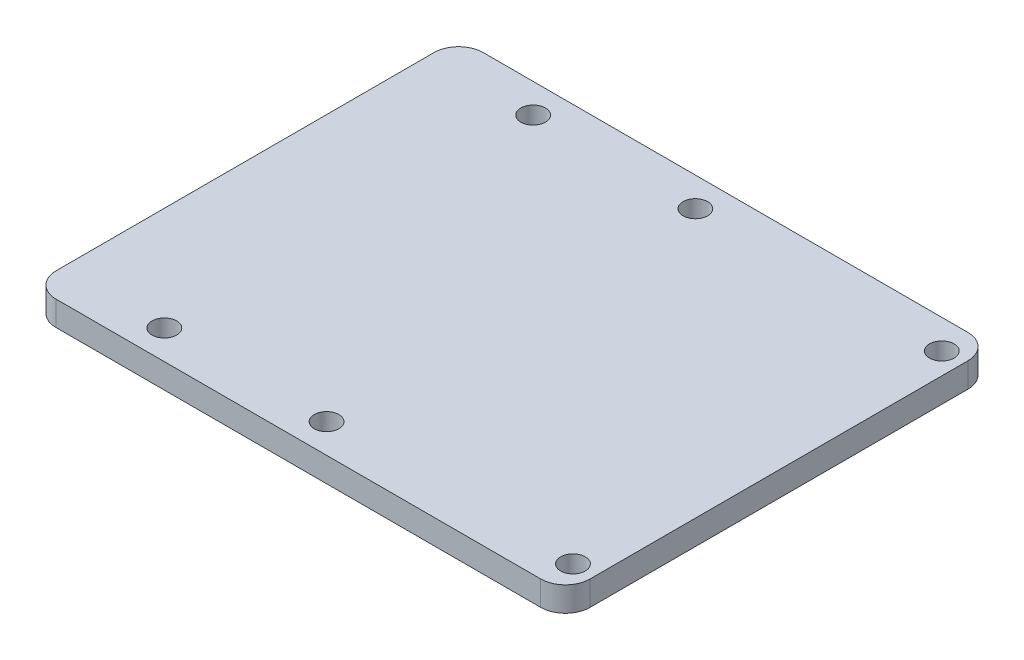
ISO-10303-21;
HEADER;
FILE_DESCRIPTION(('STEP AP214'),'2;1');
FILE_NAME('part.step','',(''),(''),'','','');
FILE_SCHEMA(('AUTOMOTIVE_DESIGN { 1 0 10303 214 1 1 1 1 }'));
ENDSEC;
DATA;
#1=APPLICATION_CONTEXT('core data for automotive mechanical design processes');
#2=APPLICATION_PROTOCOL_DEFINITION('international standard','automotive_design',2000,#1);
#3=PRODUCT_CONTEXT('',#1,'mechanical');
#4=PRODUCT('Part','Part','',(#3));
#5=PRODUCT_RELATED_PRODUCT_CATEGORY('part','',(#4));
#6=PRODUCT_DEFINITION_FORMATION('','',#4);
#7=PRODUCT_DEFINITION_CONTEXT('part definition',#1,'design');
#8=PRODUCT_DEFINITION('design','',#6,#7);
#9=PRODUCT_DEFINITION_SHAPE('','',#8);
#10=(LENGTH_UNIT() NAMED_UNIT(*) SI_UNIT(.MILLI.,.METRE.));
#11=(NAMED_UNIT(*) PLANE_ANGLE_UNIT() SI_UNIT($,.RADIAN.));
#12=(NAMED_UNIT(*) SI_UNIT($,.STERADIAN.) SOLID_ANGLE_UNIT());
#13=UNCERTAINTY_MEASURE_WITH_UNIT(LENGTH_MEASURE(1.E-05),#10,'distance_accuracy_value','');
#14=(GEOMETRIC_REPRESENTATION_CONTEXT(3) GLOBAL_UNCERTAINTY_ASSIGNED_CONTEXT((#13)) GLOBAL_UNIT_ASSIGNED_CONTEXT((#10,
#11,#12)) REPRESENTATION_CONTEXT('',''));
#15=CARTESIAN_POINT('',(0.,0.,0.));
#16=DIRECTION('',(0.,0.,1.));
#17=DIRECTION('',(1.,0.,0.));
#18=AXIS2_PLACEMENT_3D('',#15,#16,#17);
#19=CARTESIAN_POINT('',(0.,3.,26.));
#20=DIRECTION('',(0.,0.,-1.));
#21=DIRECTION('',(-1.,0.,0.));
#22=AXIS2_PLACEMENT_3D('',#19,#20,#21);
#23=PLANE('',#22);
#24=DIRECTION('',(1.,0.,0.));
#25=VECTOR('',#24,1.);
#26=CARTESIAN_POINT('',(0.,0.,26.));
#27=LINE('',#26,#25);
#28=CARTESIAN_POINT('',(-34.5,0.,26.));
#29=VERTEX_POINT('',#28);
#30=CARTESIAN_POINT('',(24.5,0.,26.));
#31=VERTEX_POINT('',#30);
#32=EDGE_CURVE('E142',#29,#31,#27,.T.);
#33=ORIENTED_EDGE('',*,*,#32,.T.);
#34=DIRECTION('',(0.,-1.,0.));
#35=VECTOR('',#34,1.);
#36=CARTESIAN_POINT('',(24.5,3.,26.));
#37=LINE('',#36,#35);
#38=CARTESIAN_POINT('',(24.5,3.,26.));
#39=VERTEX_POINT('',#38);
#40=EDGE_CURVE('E119',#31,#39,#37,.F.);
#41=ORIENTED_EDGE('',*,*,#40,.T.);
#42=DIRECTION('',(1.,0.,0.));
#43=VECTOR('',#42,1.);
#44=CARTESIAN_POINT('',(0.,3.,26.));
#45=LINE('',#44,#43);
#46=CARTESIAN_POINT('',(-34.5,3.,26.));
#47=VERTEX_POINT('',#46);
#48=EDGE_CURVE('E198',#47,#39,#45,.T.);
#49=ORIENTED_EDGE('',*,*,#48,.F.);
#50=DIRECTION('',(0.,-1.,0.));
#51=VECTOR('',#50,1.);
#52=CARTESIAN_POINT('',(-34.5,0.,26.));
#53=LINE('',#52,#51);
#54=EDGE_CURVE('E124',#47,#29,#53,.T.);
#55=ORIENTED_EDGE('',*,*,#54,.T.);
#56=EDGE_LOOP('',(#33,#41,#49,#55));
#57=FACE_BOUND('',#56,.T.);
#58=ADVANCED_FACE('F45',(#57),#23,.F.);
#59=CARTESIAN_POINT('',(27.5,3.,0.));
#60=DIRECTION('',(-1.,0.,0.));
#61=DIRECTION('',(0.,0.,1.));
#62=AXIS2_PLACEMENT_3D('',#59,#60,#61);
#63=PLANE('',#62);
#64=DIRECTION('',(0.,0.,-1.));
#65=VECTOR('',#64,1.);
#66=CARTESIAN_POINT('',(27.5,3.,0.));
#67=LINE('',#66,#65);
#68=CARTESIAN_POINT('',(27.5,3.,23.));
#69=VERTEX_POINT('',#68);
#70=CARTESIAN_POINT('',(27.5,3.,-23.));
#71=VERTEX_POINT('',#70);
#72=EDGE_CURVE('E134',#69,#71,#67,.T.);
#73=ORIENTED_EDGE('',*,*,#72,.F.);
#74=DIRECTION('',(0.,-1.,0.));
#75=VECTOR('',#74,1.);
#76=CARTESIAN_POINT('',(27.5,3.,23.));
#77=LINE('',#76,#75);
#78=CARTESIAN_POINT('',(27.5,0.,23.));
#79=VERTEX_POINT('',#78);
#80=EDGE_CURVE('E118',#69,#79,#77,.T.);
#81=ORIENTED_EDGE('',*,*,#80,.T.);
#82=DIRECTION('',(0.,0.,-1.));
#83=VECTOR('',#82,1.);
#84=CARTESIAN_POINT('',(27.5,0.,0.));
#85=LINE('',#84,#83);
#86=CARTESIAN_POINT('',(27.5,0.,-23.));
#87=VERTEX_POINT('',#86);
#88=EDGE_CURVE('E131',#79,#87,#85,.T.);
#89=ORIENTED_EDGE('',*,*,#88,.T.);
#90=DIRECTION('',(0.,-1.,0.));
#91=VECTOR('',#90,1.);
#92=CARTESIAN_POINT('',(27.5,3.,-23.));
#93=LINE('',#92,#91);
#94=EDGE_CURVE('E136',#87,#71,#93,.F.);
#95=ORIENTED_EDGE('',*,*,#94,.T.);
#96=EDGE_LOOP('',(#73,#81,#89,#95));
#97=FACE_BOUND('',#96,.T.);
#98=ADVANCED_FACE('F130',(#97),#63,.F.);
#99=CARTESIAN_POINT('',(0.,3.,-26.));
#100=DIRECTION('',(0.,0.,-1.));
#101=DIRECTION('',(-1.,0.,0.));
#102=AXIS2_PLACEMENT_3D('',#99,#100,#101);
#103=PLANE('',#102);
#104=DIRECTION('',(1.,0.,0.));
#105=VECTOR('',#104,1.);
#106=CARTESIAN_POINT('',(0.,3.,-26.));
#107=LINE('',#106,#105);
#108=CARTESIAN_POINT('',(-34.5,3.,-26.));
#109=VERTEX_POINT('',#108);
#110=CARTESIAN_POINT('',(24.5,3.,-26.));
#111=VERTEX_POINT('',#110);
#112=EDGE_CURVE('E202',#109,#111,#107,.T.);
#113=ORIENTED_EDGE('',*,*,#112,.T.);
#114=DIRECTION('',(0.,-1.,0.));
#115=VECTOR('',#114,1.);
#116=CARTESIAN_POINT('',(24.5,0.,-26.));
#117=LINE('',#116,#115);
#118=CARTESIAN_POINT('',(24.5,0.,-26.));
#119=VERTEX_POINT('',#118);
#120=EDGE_CURVE('E11',#111,#119,#117,.T.);
#121=ORIENTED_EDGE('',*,*,#120,.T.);
#122=DIRECTION('',(1.,0.,0.));
#123=VECTOR('',#122,1.);
#124=CARTESIAN_POINT('',(0.,0.,-26.));
#125=LINE('',#124,#123);
#126=CARTESIAN_POINT('',(-34.5,0.,-26.));
#127=VERTEX_POINT('',#126);
#128=EDGE_CURVE('E141',#127,#119,#125,.T.);
#129=ORIENTED_EDGE('',*,*,#128,.F.);
#130=DIRECTION('',(0.,-1.,0.));
#131=VECTOR('',#130,1.);
#132=CARTESIAN_POINT('',(-34.5,3.,-26.));
#133=LINE('',#132,#131);
#134=EDGE_CURVE('E54',#127,#109,#133,.F.);
#135=ORIENTED_EDGE('',*,*,#134,.T.);
#136=EDGE_LOOP('',(#113,#121,#129,#135));
#137=FACE_BOUND('',#136,.T.);
#138=ADVANCED_FACE('F220',(#137),#103,.T.);
#139=CARTESIAN_POINT('',(24.8750000000005,3.,22.45));
#140=DIRECTION('',(0.,-1.,0.));
#141=DIRECTION('',(0.,0.,-1.));
#142=AXIS2_PLACEMENT_3D('',#139,#140,#141);
#143=CYLINDRICAL_SURFACE('',#142,1.5);
#144=CARTESIAN_POINT('',(24.8750000000005,3.,22.45));
#145=DIRECTION('',(0.,1.,0.));
#146=DIRECTION('',(0.,0.,1.));
#147=AXIS2_PLACEMENT_3D('',#144,#145,#146);
#148=CIRCLE('',#147,1.5);
#149=CARTESIAN_POINT('',(24.8750000000005,3.,23.95));
#150=VERTEX_POINT('',#149);
#151=EDGE_CURVE('E195',#150,#150,#148,.T.);
#152=ORIENTED_EDGE('',*,*,#151,.T.);
#153=EDGE_LOOP('',(#152));
#154=FACE_BOUND('',#153,.T.);
#155=CARTESIAN_POINT('',(24.8750000000005,0.,22.45));
#156=DIRECTION('',(0.,1.,0.));
#157=DIRECTION('',(0.,0.,1.));
#158=AXIS2_PLACEMENT_3D('',#155,#156,#157);
#159=CIRCLE('',#158,1.5);
#160=CARTESIAN_POINT('',(24.8750000000005,0.,23.95));
#161=VERTEX_POINT('',#160);
#162=EDGE_CURVE('E146',#161,#161,#159,.T.);
#163=ORIENTED_EDGE('',*,*,#162,.F.);
#164=EDGE_LOOP('',(#163));
#165=FACE_BOUND('',#164,.T.);
#166=ADVANCED_FACE('F217',(#154,#165),#143,.F.);
#167=CARTESIAN_POINT('',(-24.8749999999995,3.,22.45));
#168=DIRECTION('',(0.,-1.,0.));
#169=DIRECTION('',(0.,0.,-1.));
#170=AXIS2_PLACEMENT_3D('',#167,#168,#169);
#171=CYLINDRICAL_SURFACE('',#170,1.5);
#172=CARTESIAN_POINT('',(-24.8749999999995,3.,22.45));
#173=DIRECTION('',(0.,1.,0.));
#174=DIRECTION('',(0.,0.,1.));
#175=AXIS2_PLACEMENT_3D('',#172,#173,#174);
#176=CIRCLE('',#175,1.5);
#177=CARTESIAN_POINT('',(-24.8749999999995,3.,23.95));
#178=VERTEX_POINT('',#177);
#179=EDGE_CURVE('E192',#178,#178,#176,.T.);
#180=ORIENTED_EDGE('',*,*,#179,.T.);
#181=EDGE_LOOP('',(#180));
#182=FACE_BOUND('',#181,.T.);
#183=CARTESIAN_POINT('',(-24.8749999999995,0.,22.45));
#184=DIRECTION('',(0.,1.,0.));
#185=DIRECTION('',(0.,0.,1.));
#186=AXIS2_PLACEMENT_3D('',#183,#184,#185);
#187=CIRCLE('',#186,1.5);
#188=CARTESIAN_POINT('',(-24.8749999999995,0.,23.95));
#189=VERTEX_POINT('',#188);
#190=EDGE_CURVE('E211',#189,#189,#187,.T.);
#191=ORIENTED_EDGE('',*,*,#190,.F.);
#192=EDGE_LOOP('',(#191));
#193=FACE_BOUND('',#192,.T.);
#194=ADVANCED_FACE('F219',(#182,#193),#171,.F.);
#195=CARTESIAN_POINT('',(24.875,3.,-22.45));
#196=DIRECTION('',(0.,-1.,0.));
#197=DIRECTION('',(0.,0.,-1.));
#198=AXIS2_PLACEMENT_3D('',#195,#196,#197);
#199=CYLINDRICAL_SURFACE('',#198,1.5);
#200=CARTESIAN_POINT('',(24.875,3.,-22.45));
#201=DIRECTION('',(0.,1.,0.));
#202=DIRECTION('',(0.,0.,1.));
#203=AXIS2_PLACEMENT_3D('',#200,#201,#202);
#204=CIRCLE('',#203,1.5);
#205=CARTESIAN_POINT('',(24.875,3.,-20.95));
#206=VERTEX_POINT('',#205);
#207=EDGE_CURVE('E189',#206,#206,#204,.T.);
#208=ORIENTED_EDGE('',*,*,#207,.T.);
#209=EDGE_LOOP('',(#208));
#210=FACE_BOUND('',#209,.T.);
#211=CARTESIAN_POINT('',(24.875,0.,-22.45));
#212=DIRECTION('',(0.,1.,0.));
#213=DIRECTION('',(0.,0.,1.));
#214=AXIS2_PLACEMENT_3D('',#211,#212,#213);
#215=CIRCLE('',#214,1.5);
#216=CARTESIAN_POINT('',(24.875,0.,-20.95));
#217=VERTEX_POINT('',#216);
#218=EDGE_CURVE('E208',#217,#217,#215,.T.);
#219=ORIENTED_EDGE('',*,*,#218,.F.);
#220=EDGE_LOOP('',(#219));
#221=FACE_BOUND('',#220,.T.);
#222=ADVANCED_FACE('F226',(#210,#221),#199,.F.);
#223=CARTESIAN_POINT('',(-24.875,3.,-22.45));
#224=DIRECTION('',(0.,-1.,0.));
#225=DIRECTION('',(0.,0.,-1.));
#226=AXIS2_PLACEMENT_3D('',#223,#224,#225);
#227=CYLINDRICAL_SURFACE('',#226,1.5);
#228=CARTESIAN_POINT('',(-24.875,3.,-22.45));
#229=DIRECTION('',(0.,1.,0.));
#230=DIRECTION('',(0.,0.,1.));
#231=AXIS2_PLACEMENT_3D('',#228,#229,#230);
#232=CIRCLE('',#231,1.5);
#233=CARTESIAN_POINT('',(-24.875,3.,-20.95));
#234=VERTEX_POINT('',#233);
#235=EDGE_CURVE('E152',#234,#234,#232,.T.);
#236=ORIENTED_EDGE('',*,*,#235,.T.);
#237=EDGE_LOOP('',(#236));
#238=FACE_BOUND('',#237,.T.);
#239=CARTESIAN_POINT('',(-24.875,0.,-22.45));
#240=DIRECTION('',(0.,1.,0.));
#241=DIRECTION('',(0.,0.,1.));
#242=AXIS2_PLACEMENT_3D('',#239,#240,#241);
#243=CIRCLE('',#242,1.5);
#244=CARTESIAN_POINT('',(-24.875,0.,-20.95));
#245=VERTEX_POINT('',#244);
#246=EDGE_CURVE('E178',#245,#245,#243,.T.);
#247=ORIENTED_EDGE('',*,*,#246,.F.);
#248=EDGE_LOOP('',(#247));
#249=FACE_BOUND('',#248,.T.);
#250=ADVANCED_FACE('F245',(#238,#249),#227,.F.);
#251=CARTESIAN_POINT('',(-37.5,3.,0.));
#252=DIRECTION('',(-1.,0.,0.));
#253=DIRECTION('',(0.,0.,1.));
#254=AXIS2_PLACEMENT_3D('',#251,#252,#253);
#255=PLANE('',#254);
#256=DIRECTION('',(0.,0.,-1.));
#257=VECTOR('',#256,1.);
#258=CARTESIAN_POINT('',(-37.5,0.,0.));
#259=LINE('',#258,#257);
#260=CARTESIAN_POINT('',(-37.5,0.,23.));
#261=VERTEX_POINT('',#260);
#262=CARTESIAN_POINT('',(-37.5,0.,-23.));
#263=VERTEX_POINT('',#262);
#264=EDGE_CURVE('E144',#261,#263,#259,.T.);
#265=ORIENTED_EDGE('',*,*,#264,.F.);
#266=DIRECTION('',(0.,-1.,0.));
#267=VECTOR('',#266,1.);
#268=CARTESIAN_POINT('',(-37.5,3.,23.));
#269=LINE('',#268,#267);
#270=CARTESIAN_POINT('',(-37.5,3.,23.));
#271=VERTEX_POINT('',#270);
#272=EDGE_CURVE('E69',#261,#271,#269,.F.);
#273=ORIENTED_EDGE('',*,*,#272,.T.);
#274=DIRECTION('',(0.,0.,-1.));
#275=VECTOR('',#274,1.);
#276=CARTESIAN_POINT('',(-37.5,3.,0.));
#277=LINE('',#276,#275);
#278=CARTESIAN_POINT('',(-37.5,3.,-23.));
#279=VERTEX_POINT('',#278);
#280=EDGE_CURVE('E153',#271,#279,#277,.T.);
#281=ORIENTED_EDGE('',*,*,#280,.T.);
#282=DIRECTION('',(0.,-1.,0.));
#283=VECTOR('',#282,1.);
#284=CARTESIAN_POINT('',(-37.5,3.,-23.));
#285=LINE('',#284,#283);
#286=EDGE_CURVE('E168',#279,#263,#285,.T.);
#287=ORIENTED_EDGE('',*,*,#286,.T.);
#288=EDGE_LOOP('',(#265,#273,#281,#287));
#289=FACE_BOUND('',#288,.T.);
#290=ADVANCED_FACE('F241',(#289),#255,.T.);
#291=CARTESIAN_POINT('',(0.,3.,0.));
#292=DIRECTION('',(0.,1.,0.));
#293=DIRECTION('',(0.,0.,1.));
#294=AXIS2_PLACEMENT_3D('',#291,#292,#293);
#295=PLANE('',#294);
#296=CARTESIAN_POINT('',(-5.12499999999953,3.,22.4500000000002));
#297=DIRECTION('',(0.,1.,0.));
#298=DIRECTION('',(0.,0.,1.));
#299=AXIS2_PLACEMENT_3D('',#296,#297,#298);
#300=CIRCLE('',#299,1.5);
#301=CARTESIAN_POINT('',(-5.12499999999953,3.,23.9500000000002));
#302=VERTEX_POINT('',#301);
#303=EDGE_CURVE('E180',#302,#302,#300,.T.);
#304=ORIENTED_EDGE('',*,*,#303,.F.);
#305=EDGE_LOOP('',(#304));
#306=FACE_BOUND('',#305,.T.);
#307=CARTESIAN_POINT('',(-5.125,3.,-22.4499999999998));
#308=DIRECTION('',(0.,1.,0.));
#309=DIRECTION('',(0.,0.,1.));
#310=AXIS2_PLACEMENT_3D('',#307,#308,#309);
#311=CIRCLE('',#310,1.5);
#312=CARTESIAN_POINT('',(-5.125,3.,-20.9499999999998));
#313=VERTEX_POINT('',#312);
#314=EDGE_CURVE('E174',#313,#313,#311,.T.);
#315=ORIENTED_EDGE('',*,*,#314,.F.);
#316=EDGE_LOOP('',(#315));
#317=FACE_BOUND('',#316,.T.);
#318=ORIENTED_EDGE('',*,*,#235,.F.);
#319=EDGE_LOOP('',(#318));
#320=FACE_BOUND('',#319,.T.);
#321=ORIENTED_EDGE('',*,*,#207,.F.);
#322=EDGE_LOOP('',(#321));
#323=FACE_BOUND('',#322,.T.);
#324=ORIENTED_EDGE('',*,*,#179,.F.);
#325=EDGE_LOOP('',(#324));
#326=FACE_BOUND('',#325,.T.);
#327=ORIENTED_EDGE('',*,*,#151,.F.);
#328=EDGE_LOOP('',(#327));
#329=FACE_BOUND('',#328,.T.);
#330=ORIENTED_EDGE('',*,*,#48,.T.);
#331=CARTESIAN_POINT('',(24.5,3.,23.));
#332=DIRECTION('',(0.,1.,0.));
#333=DIRECTION('',(0.,0.,1.));
#334=AXIS2_PLACEMENT_3D('',#331,#332,#333);
#335=CIRCLE('',#334,3.);
#336=EDGE_CURVE('E166',#39,#69,#335,.T.);
#337=ORIENTED_EDGE('',*,*,#336,.T.);
#338=ORIENTED_EDGE('',*,*,#72,.T.);
#339=CARTESIAN_POINT('',(24.5,3.,-23.));
#340=DIRECTION('',(0.,1.,0.));
#341=DIRECTION('',(0.,0.,1.));
#342=AXIS2_PLACEMENT_3D('',#339,#340,#341);
#343=CIRCLE('',#342,3.);
#344=EDGE_CURVE('E162',#71,#111,#343,.T.);
#345=ORIENTED_EDGE('',*,*,#344,.T.);
#346=ORIENTED_EDGE('',*,*,#112,.F.);
#347=CARTESIAN_POINT('',(-34.5,3.,-23.));
#348=DIRECTION('',(0.,1.,0.));
#349=DIRECTION('',(0.,0.,1.));
#350=AXIS2_PLACEMENT_3D('',#347,#348,#349);
#351=CIRCLE('',#350,3.);
#352=EDGE_CURVE('E62',#109,#279,#351,.T.);
#353=ORIENTED_EDGE('',*,*,#352,.T.);
#354=ORIENTED_EDGE('',*,*,#280,.F.);
#355=CARTESIAN_POINT('',(-34.5,3.,23.));
#356=DIRECTION('',(0.,1.,0.));
#357=DIRECTION('',(0.,0.,1.));
#358=AXIS2_PLACEMENT_3D('',#355,#356,#357);
#359=CIRCLE('',#358,3.);
#360=EDGE_CURVE('E164',#271,#47,#359,.T.);
#361=ORIENTED_EDGE('',*,*,#360,.T.);
#362=EDGE_LOOP('',(#330,#337,#338,#345,#346,#353,#354,#361));
#363=FACE_BOUND('',#362,.T.);
#364=ADVANCED_FACE('F244',(#306,#317,#320,#323,#326,#329,#363),#295,.T.);
#365=CARTESIAN_POINT('',(0.,0.,0.));
#366=DIRECTION('',(0.,1.,0.));
#367=DIRECTION('',(0.,0.,1.));
#368=AXIS2_PLACEMENT_3D('',#365,#366,#367);
#369=PLANE('',#368);
#370=CARTESIAN_POINT('',(-5.12499999999953,0.,22.4500000000002));
#371=DIRECTION('',(0.,1.,0.));
#372=DIRECTION('',(0.,0.,1.));
#373=AXIS2_PLACEMENT_3D('',#370,#371,#372);
#374=CIRCLE('',#373,1.5);
#375=CARTESIAN_POINT('',(-5.12499999999953,0.,23.9500000000002));
#376=VERTEX_POINT('',#375);
#377=EDGE_CURVE('E49',#376,#376,#374,.T.);
#378=ORIENTED_EDGE('',*,*,#377,.T.);
#379=EDGE_LOOP('',(#378));
#380=FACE_BOUND('',#379,.T.);
#381=CARTESIAN_POINT('',(-5.125,0.,-22.4499999999998));
#382=DIRECTION('',(0.,1.,0.));
#383=DIRECTION('',(0.,0.,1.));
#384=AXIS2_PLACEMENT_3D('',#381,#382,#383);
#385=CIRCLE('',#384,1.5);
#386=CARTESIAN_POINT('',(-5.125,0.,-20.9499999999998));
#387=VERTEX_POINT('',#386);
#388=EDGE_CURVE('E172',#387,#387,#385,.T.);
#389=ORIENTED_EDGE('',*,*,#388,.T.);
#390=EDGE_LOOP('',(#389));
#391=FACE_BOUND('',#390,.T.);
#392=ORIENTED_EDGE('',*,*,#246,.T.);
#393=EDGE_LOOP('',(#392));
#394=FACE_BOUND('',#393,.T.);
#395=ORIENTED_EDGE('',*,*,#218,.T.);
#396=EDGE_LOOP('',(#395));
#397=FACE_BOUND('',#396,.T.);
#398=ORIENTED_EDGE('',*,*,#190,.T.);
#399=EDGE_LOOP('',(#398));
#400=FACE_BOUND('',#399,.T.);
#401=ORIENTED_EDGE('',*,*,#162,.T.);
#402=EDGE_LOOP('',(#401));
#403=FACE_BOUND('',#402,.T.);
#404=ORIENTED_EDGE('',*,*,#88,.F.);
#405=CARTESIAN_POINT('',(24.5,0.,23.));
#406=DIRECTION('',(0.,1.,0.));
#407=DIRECTION('',(0.,0.,1.));
#408=AXIS2_PLACEMENT_3D('',#405,#406,#407);
#409=CIRCLE('',#408,3.);
#410=EDGE_CURVE('E114',#79,#31,#409,.F.);
#411=ORIENTED_EDGE('',*,*,#410,.T.);
#412=ORIENTED_EDGE('',*,*,#32,.F.);
#413=CARTESIAN_POINT('',(-34.5,0.,23.));
#414=DIRECTION('',(0.,1.,0.));
#415=DIRECTION('',(0.,0.,1.));
#416=AXIS2_PLACEMENT_3D('',#413,#414,#415);
#417=CIRCLE('',#416,3.);
#418=EDGE_CURVE('E125',#29,#261,#417,.F.);
#419=ORIENTED_EDGE('',*,*,#418,.T.);
#420=ORIENTED_EDGE('',*,*,#264,.T.);
#421=CARTESIAN_POINT('',(-34.5,0.,-23.));
#422=DIRECTION('',(0.,1.,0.));
#423=DIRECTION('',(0.,0.,1.));
#424=AXIS2_PLACEMENT_3D('',#421,#422,#423);
#425=CIRCLE('',#424,3.);
#426=EDGE_CURVE('E135',#263,#127,#425,.F.);
#427=ORIENTED_EDGE('',*,*,#426,.T.);
#428=ORIENTED_EDGE('',*,*,#128,.T.);
#429=CARTESIAN_POINT('',(24.5,0.,-23.));
#430=DIRECTION('',(0.,1.,0.));
#431=DIRECTION('',(0.,0.,1.));
#432=AXIS2_PLACEMENT_3D('',#429,#430,#431);
#433=CIRCLE('',#432,3.);
#434=EDGE_CURVE('E140',#119,#87,#433,.F.);
#435=ORIENTED_EDGE('',*,*,#434,.T.);
#436=EDGE_LOOP('',(#404,#411,#412,#419,#420,#427,#428,#435));
#437=FACE_BOUND('',#436,.T.);
#438=ADVANCED_FACE('F138',(#380,#391,#394,#397,#400,#403,#437),#369,.F.);
#439=CARTESIAN_POINT('',(24.5,3.,23.));
#440=DIRECTION('',(0.,-1.,0.));
#441=DIRECTION('',(0.,0.,-1.));
#442=AXIS2_PLACEMENT_3D('',#439,#440,#441);
#443=CYLINDRICAL_SURFACE('',#442,3.);
#444=ORIENTED_EDGE('',*,*,#336,.F.);
#445=ORIENTED_EDGE('',*,*,#40,.F.);
#446=ORIENTED_EDGE('',*,*,#410,.F.);
#447=ORIENTED_EDGE('',*,*,#80,.F.);
#448=EDGE_LOOP('',(#444,#445,#446,#447));
#449=FACE_BOUND('',#448,.T.);
#450=ADVANCED_FACE('F117',(#449),#443,.T.);
#451=CARTESIAN_POINT('',(-34.5,3.,23.));
#452=DIRECTION('',(0.,1.,0.));
#453=DIRECTION('',(0.,0.,1.));
#454=AXIS2_PLACEMENT_3D('',#451,#452,#453);
#455=CYLINDRICAL_SURFACE('',#454,3.);
#456=ORIENTED_EDGE('',*,*,#360,.F.);
#457=ORIENTED_EDGE('',*,*,#272,.F.);
#458=ORIENTED_EDGE('',*,*,#418,.F.);
#459=ORIENTED_EDGE('',*,*,#54,.F.);
#460=EDGE_LOOP('',(#456,#457,#458,#459));
#461=FACE_BOUND('',#460,.T.);
#462=ADVANCED_FACE('F267',(#461),#455,.T.);
#463=CARTESIAN_POINT('',(24.5,3.,-23.));
#464=DIRECTION('',(0.,1.,0.));
#465=DIRECTION('',(0.,0.,1.));
#466=AXIS2_PLACEMENT_3D('',#463,#464,#465);
#467=CYLINDRICAL_SURFACE('',#466,3.);
#468=ORIENTED_EDGE('',*,*,#344,.F.);
#469=ORIENTED_EDGE('',*,*,#94,.F.);
#470=ORIENTED_EDGE('',*,*,#434,.F.);
#471=ORIENTED_EDGE('',*,*,#120,.F.);
#472=EDGE_LOOP('',(#468,#469,#470,#471));
#473=FACE_BOUND('',#472,.T.);
#474=ADVANCED_FACE('F261',(#473),#467,.T.);
#475=CARTESIAN_POINT('',(-34.5,3.,-23.));
#476=DIRECTION('',(0.,-1.,0.));
#477=DIRECTION('',(0.,0.,-1.));
#478=AXIS2_PLACEMENT_3D('',#475,#476,#477);
#479=CYLINDRICAL_SURFACE('',#478,3.);
#480=ORIENTED_EDGE('',*,*,#352,.F.);
#481=ORIENTED_EDGE('',*,*,#134,.F.);
#482=ORIENTED_EDGE('',*,*,#426,.F.);
#483=ORIENTED_EDGE('',*,*,#286,.F.);
#484=EDGE_LOOP('',(#480,#481,#482,#483));
#485=FACE_BOUND('',#484,.T.);
#486=ADVANCED_FACE('F47',(#485),#479,.T.);
#487=CARTESIAN_POINT('',(-5.125,-7.,-22.4499999999998));
#488=DIRECTION('',(0.,1.,0.));
#489=DIRECTION('',(0.,0.,1.));
#490=AXIS2_PLACEMENT_3D('',#487,#488,#489);
#491=CYLINDRICAL_SURFACE('',#490,1.5);
#492=ORIENTED_EDGE('',*,*,#314,.T.);
#493=EDGE_LOOP('',(#492));
#494=FACE_BOUND('',#493,.T.);
#495=ORIENTED_EDGE('',*,*,#388,.F.);
#496=EDGE_LOOP('',(#495));
#497=FACE_BOUND('',#496,.T.);
#498=ADVANCED_FACE('F255',(#494,#497),#491,.F.);
#499=CARTESIAN_POINT('',(-5.12499999999953,-7.,22.4500000000002));
#500=DIRECTION('',(0.,1.,0.));
#501=DIRECTION('',(0.,0.,1.));
#502=AXIS2_PLACEMENT_3D('',#499,#500,#501);
#503=CYLINDRICAL_SURFACE('',#502,1.5);
#504=ORIENTED_EDGE('',*,*,#303,.T.);
#505=EDGE_LOOP('',(#504));
#506=FACE_BOUND('',#505,.T.);
#507=ORIENTED_EDGE('',*,*,#377,.F.);
#508=EDGE_LOOP('',(#507));
#509=FACE_BOUND('',#508,.T.);
#510=ADVANCED_FACE('F252',(#506,#509),#503,.F.);
#511=CLOSED_SHELL('',(#58,#98,#138,#166,#194,#222,#250,#290,#364,#438,#450,#462,#474,#486,#498,#510));
#512=MANIFOLD_SOLID_BREP('B2',#511);
#513=ADVANCED_BREP_SHAPE_REPRESENTATION('',(#18,#512),#14);
#514=SHAPE_DEFINITION_REPRESENTATION(#9,#513);
ENDSEC;
END-ISO-10303-21;
